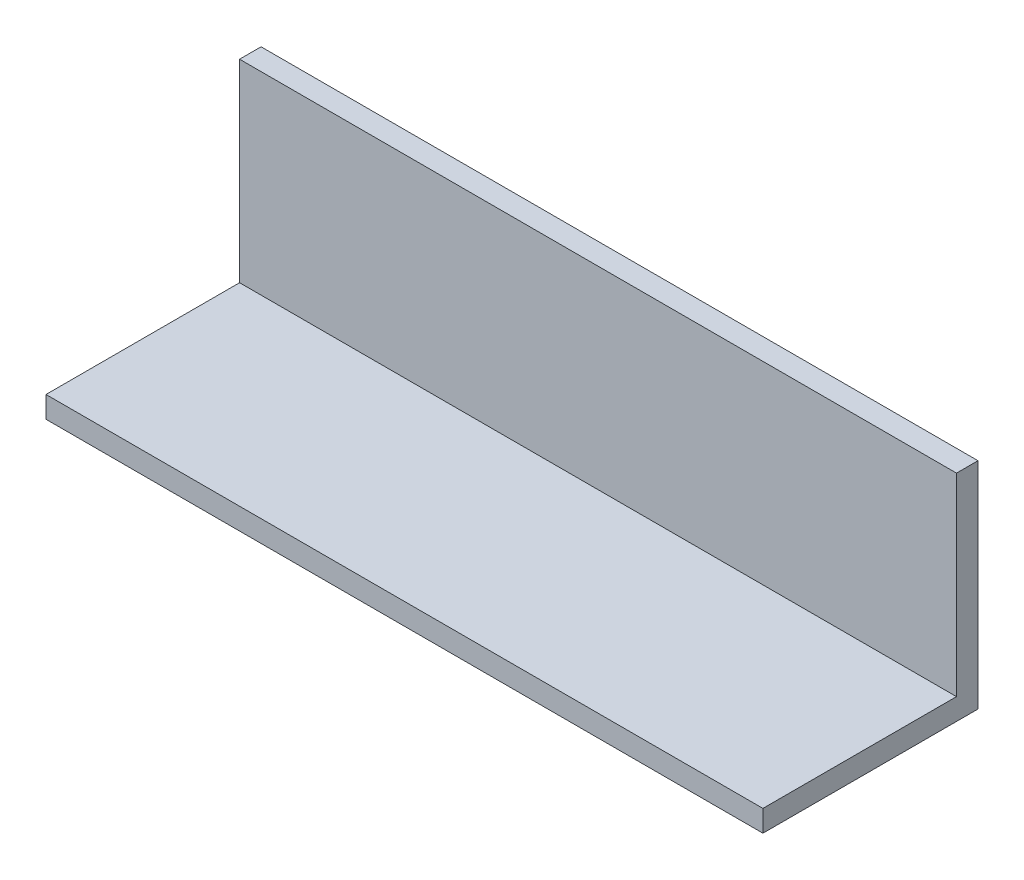
ISO-10303-21;
HEADER;
FILE_DESCRIPTION(('STEP AP214'),'2;1');
FILE_NAME('part.step','',(''),(''),'','','');
FILE_SCHEMA(('AUTOMOTIVE_DESIGN { 1 0 10303 214 1 1 1 1 }'));
ENDSEC;
DATA;
#1=APPLICATION_CONTEXT('core data for automotive mechanical design processes');
#2=APPLICATION_PROTOCOL_DEFINITION('international standard','automotive_design',2000,#1);
#3=PRODUCT_CONTEXT('',#1,'mechanical');
#4=PRODUCT('Part','Part','',(#3));
#5=PRODUCT_RELATED_PRODUCT_CATEGORY('part','',(#4));
#6=PRODUCT_DEFINITION_FORMATION('','',#4);
#7=PRODUCT_DEFINITION_CONTEXT('part definition',#1,'design');
#8=PRODUCT_DEFINITION('design','',#6,#7);
#9=PRODUCT_DEFINITION_SHAPE('','',#8);
#10=(LENGTH_UNIT() NAMED_UNIT(*) SI_UNIT(.MILLI.,.METRE.));
#11=(NAMED_UNIT(*) PLANE_ANGLE_UNIT() SI_UNIT($,.RADIAN.));
#12=(NAMED_UNIT(*) SI_UNIT($,.STERADIAN.) SOLID_ANGLE_UNIT());
#13=UNCERTAINTY_MEASURE_WITH_UNIT(LENGTH_MEASURE(1.E-05),#10,'distance_accuracy_value','');
#14=(GEOMETRIC_REPRESENTATION_CONTEXT(3) GLOBAL_UNCERTAINTY_ASSIGNED_CONTEXT((#13)) GLOBAL_UNIT_ASSIGNED_CONTEXT((#10,
#11,#12)) REPRESENTATION_CONTEXT('',''));
#15=CARTESIAN_POINT('',(0.,0.,0.));
#16=DIRECTION('',(0.,0.,1.));
#17=DIRECTION('',(1.,0.,0.));
#18=AXIS2_PLACEMENT_3D('',#15,#16,#17);
#19=CARTESIAN_POINT('',(50.,0.,0.));
#20=DIRECTION('',(0.,0.,1.));
#21=DIRECTION('',(1.,0.,0.));
#22=AXIS2_PLACEMENT_3D('',#19,#20,#21);
#23=PLANE('',#22);
#24=DIRECTION('',(0.,1.,0.));
#25=VECTOR('',#24,1.);
#26=CARTESIAN_POINT('',(0.,0.,0.));
#27=LINE('',#26,#25);
#28=CARTESIAN_POINT('',(0.,0.,0.));
#29=VERTEX_POINT('',#28);
#30=CARTESIAN_POINT('',(0.,15.,0.));
#31=VERTEX_POINT('',#30);
#32=EDGE_CURVE('E116',#29,#31,#27,.T.);
#33=ORIENTED_EDGE('',*,*,#32,.T.);
#34=DIRECTION('',(-1.,0.,0.));
#35=VECTOR('',#34,1.);
#36=CARTESIAN_POINT('',(50.,15.,0.));
#37=LINE('',#36,#35);
#38=CARTESIAN_POINT('',(50.,15.,0.));
#39=VERTEX_POINT('',#38);
#40=EDGE_CURVE('E11',#39,#31,#37,.T.);
#41=ORIENTED_EDGE('',*,*,#40,.F.);
#42=DIRECTION('',(0.,1.,0.));
#43=VECTOR('',#42,1.);
#44=CARTESIAN_POINT('',(50.,0.,0.));
#45=LINE('',#44,#43);
#46=CARTESIAN_POINT('',(50.,0.,0.));
#47=VERTEX_POINT('',#46);
#48=EDGE_CURVE('E126',#47,#39,#45,.T.);
#49=ORIENTED_EDGE('',*,*,#48,.F.);
#50=DIRECTION('',(-1.,0.,0.));
#51=VECTOR('',#50,1.);
#52=CARTESIAN_POINT('',(50.,0.,0.));
#53=LINE('',#52,#51);
#54=EDGE_CURVE('E112',#47,#29,#53,.T.);
#55=ORIENTED_EDGE('',*,*,#54,.T.);
#56=EDGE_LOOP('',(#33,#41,#49,#55));
#57=FACE_BOUND('',#56,.T.);
#58=ADVANCED_FACE('F32',(#57),#23,.F.);
#59=CARTESIAN_POINT('',(50.,15.,0.));
#60=DIRECTION('',(0.,-1.,0.));
#61=DIRECTION('',(0.,0.,-1.));
#62=AXIS2_PLACEMENT_3D('',#59,#60,#61);
#63=PLANE('',#62);
#64=DIRECTION('',(0.,0.,1.));
#65=VECTOR('',#64,1.);
#66=CARTESIAN_POINT('',(0.,15.,0.));
#67=LINE('',#66,#65);
#68=CARTESIAN_POINT('',(0.,15.,1.5));
#69=VERTEX_POINT('',#68);
#70=EDGE_CURVE('E119',#31,#69,#67,.T.);
#71=ORIENTED_EDGE('',*,*,#70,.T.);
#72=DIRECTION('',(-1.,0.,0.));
#73=VECTOR('',#72,1.);
#74=CARTESIAN_POINT('',(50.,15.,1.5));
#75=LINE('',#74,#73);
#76=CARTESIAN_POINT('',(50.,15.,1.5));
#77=VERTEX_POINT('',#76);
#78=EDGE_CURVE('E40',#77,#69,#75,.T.);
#79=ORIENTED_EDGE('',*,*,#78,.F.);
#80=DIRECTION('',(0.,0.,1.));
#81=VECTOR('',#80,1.);
#82=CARTESIAN_POINT('',(50.,15.,0.));
#83=LINE('',#82,#81);
#84=EDGE_CURVE('E85',#39,#77,#83,.T.);
#85=ORIENTED_EDGE('',*,*,#84,.F.);
#86=ORIENTED_EDGE('',*,*,#40,.T.);
#87=EDGE_LOOP('',(#71,#79,#85,#86));
#88=FACE_BOUND('',#87,.T.);
#89=ADVANCED_FACE('F150',(#88),#63,.F.);
#90=CARTESIAN_POINT('',(50.,1.5,1.5));
#91=DIRECTION('',(0.,0.,-1.));
#92=DIRECTION('',(-1.,0.,0.));
#93=AXIS2_PLACEMENT_3D('',#90,#91,#92);
#94=PLANE('',#93);
#95=DIRECTION('',(0.,-1.,0.));
#96=VECTOR('',#95,1.);
#97=CARTESIAN_POINT('',(0.,1.5,1.5));
#98=LINE('',#97,#96);
#99=CARTESIAN_POINT('',(0.,1.5,1.5));
#100=VERTEX_POINT('',#99);
#101=EDGE_CURVE('E121',#69,#100,#98,.T.);
#102=ORIENTED_EDGE('',*,*,#101,.T.);
#103=DIRECTION('',(-1.,0.,0.));
#104=VECTOR('',#103,1.);
#105=CARTESIAN_POINT('',(50.,1.5,1.5));
#106=LINE('',#105,#104);
#107=CARTESIAN_POINT('',(50.,1.5,1.5));
#108=VERTEX_POINT('',#107);
#109=EDGE_CURVE('E107',#108,#100,#106,.T.);
#110=ORIENTED_EDGE('',*,*,#109,.F.);
#111=DIRECTION('',(0.,-1.,0.));
#112=VECTOR('',#111,1.);
#113=CARTESIAN_POINT('',(50.,1.5,1.5));
#114=LINE('',#113,#112);
#115=EDGE_CURVE('E98',#77,#108,#114,.T.);
#116=ORIENTED_EDGE('',*,*,#115,.F.);
#117=ORIENTED_EDGE('',*,*,#78,.T.);
#118=EDGE_LOOP('',(#102,#110,#116,#117));
#119=FACE_BOUND('',#118,.T.);
#120=ADVANCED_FACE('F132',(#119),#94,.F.);
#121=CARTESIAN_POINT('',(50.,1.5,1.5));
#122=DIRECTION('',(0.,-1.,0.));
#123=DIRECTION('',(0.,0.,-1.));
#124=AXIS2_PLACEMENT_3D('',#121,#122,#123);
#125=PLANE('',#124);
#126=DIRECTION('',(0.,0.,1.));
#127=VECTOR('',#126,1.);
#128=CARTESIAN_POINT('',(0.,1.5,1.5));
#129=LINE('',#128,#127);
#130=CARTESIAN_POINT('',(0.,1.5,15.));
#131=VERTEX_POINT('',#130);
#132=EDGE_CURVE('E106',#100,#131,#129,.T.);
#133=ORIENTED_EDGE('',*,*,#132,.T.);
#134=DIRECTION('',(-1.,0.,0.));
#135=VECTOR('',#134,1.);
#136=CARTESIAN_POINT('',(50.,1.5,15.));
#137=LINE('',#136,#135);
#138=CARTESIAN_POINT('',(50.,1.5,15.));
#139=VERTEX_POINT('',#138);
#140=EDGE_CURVE('E103',#139,#131,#137,.T.);
#141=ORIENTED_EDGE('',*,*,#140,.F.);
#142=DIRECTION('',(0.,0.,1.));
#143=VECTOR('',#142,1.);
#144=CARTESIAN_POINT('',(50.,1.5,1.5));
#145=LINE('',#144,#143);
#146=EDGE_CURVE('E92',#108,#139,#145,.T.);
#147=ORIENTED_EDGE('',*,*,#146,.F.);
#148=ORIENTED_EDGE('',*,*,#109,.T.);
#149=EDGE_LOOP('',(#133,#141,#147,#148));
#150=FACE_BOUND('',#149,.T.);
#151=ADVANCED_FACE('F104',(#150),#125,.F.);
#152=CARTESIAN_POINT('',(50.,0.,15.));
#153=DIRECTION('',(0.,0.,-1.));
#154=DIRECTION('',(-1.,0.,0.));
#155=AXIS2_PLACEMENT_3D('',#152,#153,#154);
#156=PLANE('',#155);
#157=DIRECTION('',(0.,-1.,0.));
#158=VECTOR('',#157,1.);
#159=CARTESIAN_POINT('',(0.,0.,15.));
#160=LINE('',#159,#158);
#161=CARTESIAN_POINT('',(0.,0.,15.));
#162=VERTEX_POINT('',#161);
#163=EDGE_CURVE('E71',#131,#162,#160,.T.);
#164=ORIENTED_EDGE('',*,*,#163,.T.);
#165=DIRECTION('',(-1.,0.,0.));
#166=VECTOR('',#165,1.);
#167=CARTESIAN_POINT('',(50.,0.,15.));
#168=LINE('',#167,#166);
#169=CARTESIAN_POINT('',(50.,0.,15.));
#170=VERTEX_POINT('',#169);
#171=EDGE_CURVE('E108',#170,#162,#168,.T.);
#172=ORIENTED_EDGE('',*,*,#171,.F.);
#173=DIRECTION('',(0.,-1.,0.));
#174=VECTOR('',#173,1.);
#175=CARTESIAN_POINT('',(50.,0.,15.));
#176=LINE('',#175,#174);
#177=EDGE_CURVE('E96',#139,#170,#176,.T.);
#178=ORIENTED_EDGE('',*,*,#177,.F.);
#179=ORIENTED_EDGE('',*,*,#140,.T.);
#180=EDGE_LOOP('',(#164,#172,#178,#179));
#181=FACE_BOUND('',#180,.T.);
#182=ADVANCED_FACE('F110',(#181),#156,.F.);
#183=CARTESIAN_POINT('',(50.,0.,0.));
#184=DIRECTION('',(0.,1.,0.));
#185=DIRECTION('',(0.,0.,1.));
#186=AXIS2_PLACEMENT_3D('',#183,#184,#185);
#187=PLANE('',#186);
#188=DIRECTION('',(0.,0.,-1.));
#189=VECTOR('',#188,1.);
#190=CARTESIAN_POINT('',(0.,0.,0.));
#191=LINE('',#190,#189);
#192=EDGE_CURVE('E77',#162,#29,#191,.T.);
#193=ORIENTED_EDGE('',*,*,#192,.T.);
#194=ORIENTED_EDGE('',*,*,#54,.F.);
#195=DIRECTION('',(0.,0.,-1.));
#196=VECTOR('',#195,1.);
#197=CARTESIAN_POINT('',(50.,0.,0.));
#198=LINE('',#197,#196);
#199=EDGE_CURVE('E48',#170,#47,#198,.T.);
#200=ORIENTED_EDGE('',*,*,#199,.F.);
#201=ORIENTED_EDGE('',*,*,#171,.T.);
#202=EDGE_LOOP('',(#193,#194,#200,#201));
#203=FACE_BOUND('',#202,.T.);
#204=ADVANCED_FACE('F139',(#203),#187,.F.);
#205=CARTESIAN_POINT('',(50.,0.,0.));
#206=DIRECTION('',(1.,0.,0.));
#207=DIRECTION('',(0.,0.,-1.));
#208=AXIS2_PLACEMENT_3D('',#205,#206,#207);
#209=PLANE('',#208);
#210=ORIENTED_EDGE('',*,*,#48,.T.);
#211=ORIENTED_EDGE('',*,*,#84,.T.);
#212=ORIENTED_EDGE('',*,*,#115,.T.);
#213=ORIENTED_EDGE('',*,*,#146,.T.);
#214=ORIENTED_EDGE('',*,*,#177,.T.);
#215=ORIENTED_EDGE('',*,*,#199,.T.);
#216=EDGE_LOOP('',(#210,#211,#212,#213,#214,#215));
#217=FACE_BOUND('',#216,.T.);
#218=ADVANCED_FACE('F94',(#217),#209,.T.);
#219=CARTESIAN_POINT('',(0.,0.,0.));
#220=DIRECTION('',(1.,0.,0.));
#221=DIRECTION('',(0.,0.,-1.));
#222=AXIS2_PLACEMENT_3D('',#219,#220,#221);
#223=PLANE('',#222);
#224=ORIENTED_EDGE('',*,*,#32,.F.);
#225=ORIENTED_EDGE('',*,*,#192,.F.);
#226=ORIENTED_EDGE('',*,*,#163,.F.);
#227=ORIENTED_EDGE('',*,*,#132,.F.);
#228=ORIENTED_EDGE('',*,*,#101,.F.);
#229=ORIENTED_EDGE('',*,*,#70,.F.);
#230=EDGE_LOOP('',(#224,#225,#226,#227,#228,#229));
#231=FACE_BOUND('',#230,.T.);
#232=ADVANCED_FACE('F135',(#231),#223,.F.);
#233=CLOSED_SHELL('',(#58,#89,#120,#151,#182,#204,#218,#232));
#234=MANIFOLD_SOLID_BREP('B2',#233);
#235=ADVANCED_BREP_SHAPE_REPRESENTATION('',(#18,#234),#14);
#236=SHAPE_DEFINITION_REPRESENTATION(#9,#235);
ENDSEC;
END-ISO-10303-21;
